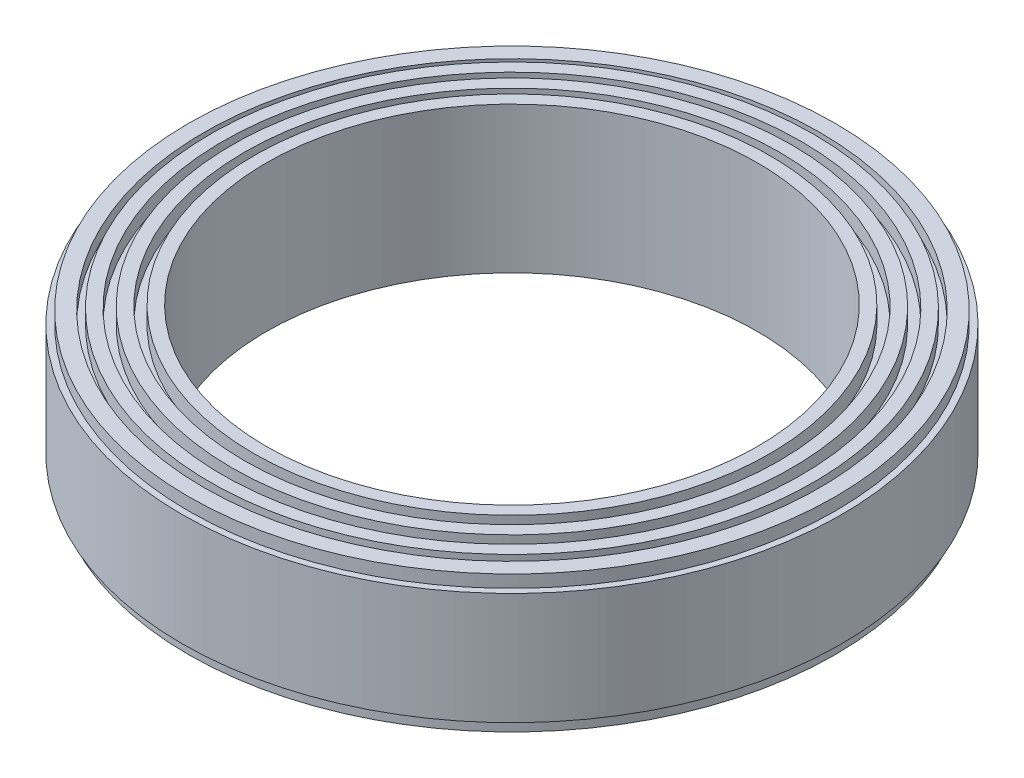
ISO-10303-21;
HEADER;
FILE_DESCRIPTION(('STEP AP214'),'2;1');
FILE_NAME('part.step','',(''),(''),'','','');
FILE_SCHEMA(('AUTOMOTIVE_DESIGN { 1 0 10303 214 1 1 1 1 }'));
ENDSEC;
DATA;
#1=APPLICATION_CONTEXT('core data for automotive mechanical design processes');
#2=APPLICATION_PROTOCOL_DEFINITION('international standard','automotive_design',2000,#1);
#3=PRODUCT_CONTEXT('',#1,'mechanical');
#4=PRODUCT('Part','Part','',(#3));
#5=PRODUCT_RELATED_PRODUCT_CATEGORY('part','',(#4));
#6=PRODUCT_DEFINITION_FORMATION('','',#4);
#7=PRODUCT_DEFINITION_CONTEXT('part definition',#1,'design');
#8=PRODUCT_DEFINITION('design','',#6,#7);
#9=PRODUCT_DEFINITION_SHAPE('','',#8);
#10=(LENGTH_UNIT() NAMED_UNIT(*) SI_UNIT(.MILLI.,.METRE.));
#11=(NAMED_UNIT(*) PLANE_ANGLE_UNIT() SI_UNIT($,.RADIAN.));
#12=(NAMED_UNIT(*) SI_UNIT($,.STERADIAN.) SOLID_ANGLE_UNIT());
#13=UNCERTAINTY_MEASURE_WITH_UNIT(LENGTH_MEASURE(1.E-05),#10,'distance_accuracy_value','');
#14=(GEOMETRIC_REPRESENTATION_CONTEXT(3) GLOBAL_UNCERTAINTY_ASSIGNED_CONTEXT((#13)) GLOBAL_UNIT_ASSIGNED_CONTEXT((#10,
#11,#12)) REPRESENTATION_CONTEXT('',''));
#15=CARTESIAN_POINT('',(0.,0.,0.));
#16=DIRECTION('',(0.,0.,1.));
#17=DIRECTION('',(1.,0.,0.));
#18=AXIS2_PLACEMENT_3D('',#15,#16,#17);
#19=CARTESIAN_POINT('',(0.,18.,0.));
#20=DIRECTION('',(0.,1.,0.));
#21=DIRECTION('',(0.,0.,1.));
#22=AXIS2_PLACEMENT_3D('',#19,#20,#21);
#23=PLANE('',#22);
#24=CARTESIAN_POINT('',(0.,18.,0.));
#25=DIRECTION('',(0.,1.,0.));
#26=DIRECTION('',(0.,0.,1.));
#27=AXIS2_PLACEMENT_3D('',#24,#25,#26);
#28=CIRCLE('',#27,104.);
#29=CARTESIAN_POINT('',(0.,18.,104.));
#30=VERTEX_POINT('',#29);
#31=EDGE_CURVE('E98',#30,#30,#28,.F.);
#32=ORIENTED_EDGE('',*,*,#31,.T.);
#33=EDGE_LOOP('',(#32));
#34=FACE_BOUND('',#33,.T.);
#35=CARTESIAN_POINT('',(0.,18.,0.));
#36=DIRECTION('',(0.,1.,0.));
#37=DIRECTION('',(0.,0.,1.));
#38=AXIS2_PLACEMENT_3D('',#35,#36,#37);
#39=CIRCLE('',#38,106.);
#40=CARTESIAN_POINT('',(0.,18.,106.));
#41=VERTEX_POINT('',#40);
#42=EDGE_CURVE('E102',#41,#41,#39,.T.);
#43=ORIENTED_EDGE('',*,*,#42,.T.);
#44=EDGE_LOOP('',(#43));
#45=FACE_BOUND('',#44,.T.);
#46=ADVANCED_FACE('F37',(#34,#45),#23,.T.);
#47=CARTESIAN_POINT('',(0.,-18.,0.));
#48=DIRECTION('',(0.,1.,0.));
#49=DIRECTION('',(0.,0.,1.));
#50=AXIS2_PLACEMENT_3D('',#47,#48,#49);
#51=PLANE('',#50);
#52=CARTESIAN_POINT('',(0.,-18.,0.));
#53=DIRECTION('',(0.,1.,0.));
#54=DIRECTION('',(0.,0.,1.));
#55=AXIS2_PLACEMENT_3D('',#52,#53,#54);
#56=CIRCLE('',#55,104.);
#57=CARTESIAN_POINT('',(0.,-18.,104.));
#58=VERTEX_POINT('',#57);
#59=EDGE_CURVE('E97',#58,#58,#56,.F.);
#60=ORIENTED_EDGE('',*,*,#59,.F.);
#61=EDGE_LOOP('',(#60));
#62=FACE_BOUND('',#61,.T.);
#63=CARTESIAN_POINT('',(0.,-18.,0.));
#64=DIRECTION('',(0.,1.,0.));
#65=DIRECTION('',(0.,0.,1.));
#66=AXIS2_PLACEMENT_3D('',#63,#64,#65);
#67=CIRCLE('',#66,106.);
#68=CARTESIAN_POINT('',(0.,-18.,106.));
#69=VERTEX_POINT('',#68);
#70=EDGE_CURVE('E101',#69,#69,#67,.T.);
#71=ORIENTED_EDGE('',*,*,#70,.F.);
#72=EDGE_LOOP('',(#71));
#73=FACE_BOUND('',#72,.T.);
#74=ADVANCED_FACE('F167',(#62,#73),#51,.F.);
#75=CARTESIAN_POINT('',(0.,18.,0.));
#76=DIRECTION('',(0.,-1.,0.));
#77=DIRECTION('',(0.,0.,-1.));
#78=AXIS2_PLACEMENT_3D('',#75,#76,#77);
#79=CYLINDRICAL_SURFACE('',#78,106.);
#80=ORIENTED_EDGE('',*,*,#42,.F.);
#81=EDGE_LOOP('',(#80));
#82=FACE_BOUND('',#81,.T.);
#83=ORIENTED_EDGE('',*,*,#70,.T.);
#84=EDGE_LOOP('',(#83));
#85=FACE_BOUND('',#84,.T.);
#86=ADVANCED_FACE('F39',(#82,#85),#79,.T.);
#87=CARTESIAN_POINT('',(0.,22.,0.));
#88=DIRECTION('',(0.,-1.,0.));
#89=DIRECTION('',(0.,0.,-1.));
#90=AXIS2_PLACEMENT_3D('',#87,#88,#89);
#91=CYLINDRICAL_SURFACE('',#90,104.);
#92=CARTESIAN_POINT('',(0.,-22.,0.));
#93=DIRECTION('',(0.,1.,0.));
#94=DIRECTION('',(0.,0.,1.));
#95=AXIS2_PLACEMENT_3D('',#92,#93,#94);
#96=CIRCLE('',#95,104.);
#97=CARTESIAN_POINT('',(0.,-22.,104.));
#98=VERTEX_POINT('',#97);
#99=EDGE_CURVE('E85',#98,#98,#96,.T.);
#100=ORIENTED_EDGE('',*,*,#99,.T.);
#101=EDGE_LOOP('',(#100));
#102=FACE_BOUND('',#101,.T.);
#103=ORIENTED_EDGE('',*,*,#59,.T.);
#104=EDGE_LOOP('',(#103));
#105=FACE_BOUND('',#104,.T.);
#106=ADVANCED_FACE('F241',(#102,#105),#91,.T.);
#107=CARTESIAN_POINT('',(0.,-22.,0.));
#108=DIRECTION('',(0.,1.,0.));
#109=DIRECTION('',(0.,0.,1.));
#110=AXIS2_PLACEMENT_3D('',#107,#108,#109);
#111=PLANE('',#110);
#112=ORIENTED_EDGE('',*,*,#99,.F.);
#113=EDGE_LOOP('',(#112));
#114=FACE_BOUND('',#113,.T.);
#115=CARTESIAN_POINT('',(0.,-22.,0.));
#116=DIRECTION('',(0.,1.,0.));
#117=DIRECTION('',(0.,0.,1.));
#118=AXIS2_PLACEMENT_3D('',#115,#116,#117);
#119=CIRCLE('',#118,99.);
#120=CARTESIAN_POINT('',(0.,-22.,99.));
#121=VERTEX_POINT('',#120);
#122=EDGE_CURVE('E81',#121,#121,#119,.T.);
#123=ORIENTED_EDGE('',*,*,#122,.T.);
#124=EDGE_LOOP('',(#123));
#125=FACE_BOUND('',#124,.T.);
#126=ADVANCED_FACE('F239',(#114,#125),#111,.F.);
#127=CARTESIAN_POINT('',(0.,22.,0.));
#128=DIRECTION('',(0.,-1.,0.));
#129=DIRECTION('',(0.,0.,-1.));
#130=AXIS2_PLACEMENT_3D('',#127,#128,#129);
#131=CYLINDRICAL_SURFACE('',#130,99.);
#132=ORIENTED_EDGE('',*,*,#122,.F.);
#133=EDGE_LOOP('',(#132));
#134=FACE_BOUND('',#133,.T.);
#135=CARTESIAN_POINT('',(0.,-18.,0.));
#136=DIRECTION('',(0.,1.,0.));
#137=DIRECTION('',(0.,0.,1.));
#138=AXIS2_PLACEMENT_3D('',#135,#136,#137);
#139=CIRCLE('',#138,99.);
#140=CARTESIAN_POINT('',(0.,-18.,99.));
#141=VERTEX_POINT('',#140);
#142=EDGE_CURVE('E91',#141,#141,#139,.F.);
#143=ORIENTED_EDGE('',*,*,#142,.F.);
#144=EDGE_LOOP('',(#143));
#145=FACE_BOUND('',#144,.T.);
#146=ADVANCED_FACE('F197',(#134,#145),#131,.F.);
#147=CARTESIAN_POINT('',(0.,22.,0.));
#148=DIRECTION('',(0.,1.,0.));
#149=DIRECTION('',(0.,0.,1.));
#150=AXIS2_PLACEMENT_3D('',#147,#148,#149);
#151=PLANE('',#150);
#152=CARTESIAN_POINT('',(0.,22.,0.));
#153=DIRECTION('',(0.,1.,0.));
#154=DIRECTION('',(0.,0.,1.));
#155=AXIS2_PLACEMENT_3D('',#152,#153,#154);
#156=CIRCLE('',#155,104.);
#157=CARTESIAN_POINT('',(0.,22.,104.));
#158=VERTEX_POINT('',#157);
#159=EDGE_CURVE('E88',#158,#158,#156,.T.);
#160=ORIENTED_EDGE('',*,*,#159,.T.);
#161=EDGE_LOOP('',(#160));
#162=FACE_BOUND('',#161,.T.);
#163=CARTESIAN_POINT('',(0.,22.,0.));
#164=DIRECTION('',(0.,1.,0.));
#165=DIRECTION('',(0.,0.,1.));
#166=AXIS2_PLACEMENT_3D('',#163,#164,#165);
#167=CIRCLE('',#166,99.);
#168=CARTESIAN_POINT('',(0.,22.,99.));
#169=VERTEX_POINT('',#168);
#170=EDGE_CURVE('E82',#169,#169,#167,.T.);
#171=ORIENTED_EDGE('',*,*,#170,.F.);
#172=EDGE_LOOP('',(#171));
#173=FACE_BOUND('',#172,.T.);
#174=ADVANCED_FACE('F235',(#162,#173),#151,.T.);
#175=ORIENTED_EDGE('',*,*,#31,.F.);
#176=EDGE_LOOP('',(#175));
#177=FACE_BOUND('',#176,.T.);
#178=ORIENTED_EDGE('',*,*,#159,.F.);
#179=EDGE_LOOP('',(#178));
#180=FACE_BOUND('',#179,.T.);
#181=ADVANCED_FACE('F194',(#177,#180),#91,.T.);
#182=CARTESIAN_POINT('',(0.,18.,0.));
#183=DIRECTION('',(0.,1.,0.));
#184=DIRECTION('',(0.,0.,1.));
#185=AXIS2_PLACEMENT_3D('',#182,#183,#184);
#186=CIRCLE('',#185,99.);
#187=CARTESIAN_POINT('',(0.,18.,99.));
#188=VERTEX_POINT('',#187);
#189=EDGE_CURVE('E94',#188,#188,#186,.F.);
#190=ORIENTED_EDGE('',*,*,#189,.T.);
#191=EDGE_LOOP('',(#190));
#192=FACE_BOUND('',#191,.T.);
#193=ORIENTED_EDGE('',*,*,#170,.T.);
#194=EDGE_LOOP('',(#193));
#195=FACE_BOUND('',#194,.T.);
#196=ADVANCED_FACE('F185',(#192,#195),#131,.F.);
#197=CARTESIAN_POINT('',(0.,18.,0.));
#198=DIRECTION('',(0.,1.,0.));
#199=DIRECTION('',(0.,0.,1.));
#200=AXIS2_PLACEMENT_3D('',#197,#198,#199);
#201=CIRCLE('',#200,97.);
#202=CARTESIAN_POINT('',(0.,18.,-97.));
#203=VERTEX_POINT('',#202);
#204=EDGE_CURVE('E78',#203,#203,#201,.F.);
#205=ORIENTED_EDGE('',*,*,#204,.T.);
#206=EDGE_LOOP('',(#205));
#207=FACE_BOUND('',#206,.T.);
#208=ORIENTED_EDGE('',*,*,#189,.F.);
#209=EDGE_LOOP('',(#208));
#210=FACE_BOUND('',#209,.T.);
#211=ADVANCED_FACE('F171',(#207,#210),#23,.T.);
#212=CARTESIAN_POINT('',(0.,-18.,0.));
#213=DIRECTION('',(0.,1.,0.));
#214=DIRECTION('',(0.,0.,1.));
#215=AXIS2_PLACEMENT_3D('',#212,#213,#214);
#216=CIRCLE('',#215,97.);
#217=CARTESIAN_POINT('',(0.,-18.,-97.));
#218=VERTEX_POINT('',#217);
#219=EDGE_CURVE('E77',#218,#218,#216,.F.);
#220=ORIENTED_EDGE('',*,*,#219,.F.);
#221=EDGE_LOOP('',(#220));
#222=FACE_BOUND('',#221,.T.);
#223=ORIENTED_EDGE('',*,*,#142,.T.);
#224=EDGE_LOOP('',(#223));
#225=FACE_BOUND('',#224,.T.);
#226=ADVANCED_FACE('F177',(#222,#225),#51,.F.);
#227=CARTESIAN_POINT('',(0.,22.5,0.));
#228=DIRECTION('',(0.,-1.,0.));
#229=DIRECTION('',(0.,0.,-1.));
#230=AXIS2_PLACEMENT_3D('',#227,#228,#229);
#231=CYLINDRICAL_SURFACE('',#230,97.);
#232=CARTESIAN_POINT('',(0.,-22.5,0.));
#233=DIRECTION('',(0.,1.,0.));
#234=DIRECTION('',(0.,0.,1.));
#235=AXIS2_PLACEMENT_3D('',#232,#233,#234);
#236=CIRCLE('',#235,97.);
#237=CARTESIAN_POINT('',(0.,-22.5,-97.));
#238=VERTEX_POINT('',#237);
#239=EDGE_CURVE('E66',#238,#238,#236,.T.);
#240=CARTESIAN_POINT('',(0.,-22.5,-97.));
#241=CARTESIAN_POINT('',(0.,-22.453125,-97.));
#242=CARTESIAN_POINT('',(0.,-22.40625,-97.));
#243=CARTESIAN_POINT('',(0.,-22.3125,-97.));
#244=CARTESIAN_POINT('',(0.,-22.265625,-97.));
#245=CARTESIAN_POINT('',(0.,-22.171875,-97.));
#246=CARTESIAN_POINT('',(0.,-22.125,-97.));
#247=CARTESIAN_POINT('',(0.,-22.03125,-97.));
#248=CARTESIAN_POINT('',(0.,-21.984375,-97.));
#249=CARTESIAN_POINT('',(0.,-21.890625,-97.));
#250=CARTESIAN_POINT('',(0.,-21.84375,-97.));
#251=CARTESIAN_POINT('',(0.,-21.75,-97.));
#252=CARTESIAN_POINT('',(0.,-21.703125,-97.));
#253=CARTESIAN_POINT('',(0.,-21.609375,-97.));
#254=CARTESIAN_POINT('',(0.,-21.5625,-97.));
#255=CARTESIAN_POINT('',(0.,-21.46875,-97.));
#256=CARTESIAN_POINT('',(0.,-21.421875,-97.));
#257=CARTESIAN_POINT('',(0.,-21.328125,-97.));
#258=CARTESIAN_POINT('',(0.,-21.28125,-97.));
#259=CARTESIAN_POINT('',(0.,-21.1875,-97.));
#260=CARTESIAN_POINT('',(0.,-21.140625,-97.));
#261=CARTESIAN_POINT('',(0.,-21.046875,-97.));
#262=CARTESIAN_POINT('',(0.,-21.,-97.));
#263=CARTESIAN_POINT('',(0.,-20.90625,-97.));
#264=CARTESIAN_POINT('',(0.,-20.859375,-97.));
#265=CARTESIAN_POINT('',(0.,-20.765625,-97.));
#266=CARTESIAN_POINT('',(0.,-20.71875,-97.));
#267=CARTESIAN_POINT('',(0.,-20.625,-97.));
#268=CARTESIAN_POINT('',(0.,-20.578125,-97.));
#269=CARTESIAN_POINT('',(0.,-20.484375,-97.));
#270=CARTESIAN_POINT('',(0.,-20.4375,-97.));
#271=CARTESIAN_POINT('',(0.,-20.34375,-97.));
#272=CARTESIAN_POINT('',(0.,-20.296875,-97.));
#273=CARTESIAN_POINT('',(0.,-20.203125,-97.));
#274=CARTESIAN_POINT('',(0.,-20.15625,-97.));
#275=CARTESIAN_POINT('',(0.,-20.0625,-97.));
#276=CARTESIAN_POINT('',(0.,-20.015625,-97.));
#277=CARTESIAN_POINT('',(0.,-19.921875,-97.));
#278=CARTESIAN_POINT('',(0.,-19.875,-97.));
#279=CARTESIAN_POINT('',(0.,-19.78125,-97.));
#280=CARTESIAN_POINT('',(0.,-19.734375,-97.));
#281=CARTESIAN_POINT('',(0.,-19.640625,-97.));
#282=CARTESIAN_POINT('',(0.,-19.59375,-97.));
#283=CARTESIAN_POINT('',(0.,-19.5,-97.));
#284=CARTESIAN_POINT('',(0.,-19.453125,-97.));
#285=CARTESIAN_POINT('',(0.,-19.359375,-97.));
#286=CARTESIAN_POINT('',(0.,-19.3125,-97.));
#287=CARTESIAN_POINT('',(0.,-19.21875,-97.));
#288=CARTESIAN_POINT('',(0.,-19.171875,-97.));
#289=CARTESIAN_POINT('',(0.,-19.078125,-97.));
#290=CARTESIAN_POINT('',(0.,-19.03125,-97.));
#291=CARTESIAN_POINT('',(0.,-18.9375,-97.));
#292=CARTESIAN_POINT('',(0.,-18.890625,-97.));
#293=CARTESIAN_POINT('',(0.,-18.796875,-97.));
#294=CARTESIAN_POINT('',(0.,-18.75,-97.));
#295=CARTESIAN_POINT('',(0.,-18.65625,-97.));
#296=CARTESIAN_POINT('',(0.,-18.609375,-97.));
#297=CARTESIAN_POINT('',(0.,-18.515625,-97.));
#298=CARTESIAN_POINT('',(0.,-18.46875,-97.));
#299=CARTESIAN_POINT('',(0.,-18.375,-97.));
#300=CARTESIAN_POINT('',(0.,-18.328125,-97.));
#301=CARTESIAN_POINT('',(0.,-18.234375,-97.));
#302=CARTESIAN_POINT('',(0.,-18.1875,-97.));
#303=CARTESIAN_POINT('',(0.,-18.09375,-97.));
#304=CARTESIAN_POINT('',(0.,-18.046875,-97.));
#305=CARTESIAN_POINT('',(0.,-18.,-97.));
#306=B_SPLINE_CURVE_WITH_KNOTS('',3,(#240,#241,#242,#243,#244,#245,#246,#247,#248,#249,#250,
#251,#252,#253,#254,#255,#256,#257,#258,#259,#260,#261,#262,#263,#264,#265,#266,#267,#268,#269,
#270,#271,#272,#273,#274,#275,#276,#277,#278,#279,#280,#281,#282,#283,#284,#285,#286,#287,#288,
#289,#290,#291,#292,#293,#294,#295,#296,#297,#298,#299,#300,#301,#302,#303,#304,#305),
.UNSPECIFIED.,.F.,.F.,(4,2,2,2,2,2,2,2,2,2,2,2,2,2,2,2,2,2,2,2,2,2,2,2,2,2,2,2,2,2,2,2,4),(0.,
0.140624999999998,0.281249999999997,0.421875000000002,0.5625,0.703124999999999,
0.843750000000004,0.984375000000003,1.125,1.265625,1.40625,1.546875,1.6875,1.828125,
1.96875000000001,2.109375,2.25,2.390625,2.53125,2.671875,2.8125,2.953125,3.09375000000001,
3.234375,3.375,3.515625,3.65625,3.79687500000001,3.9375,4.078125,4.21875000000001,
4.35937500000001,4.5),.UNSPECIFIED.);
#307=EDGE_CURVE('BSEAM191',#238,#218,#306,.T.);
#308=ORIENTED_EDGE('',*,*,#239,.T.);
#309=ORIENTED_EDGE('',*,*,#219,.T.);
#310=ORIENTED_EDGE('',*,*,#307,.T.);
#311=ORIENTED_EDGE('',*,*,#307,.F.);
#312=EDGE_LOOP('',(#308,#310,#309,#311));
#313=FACE_BOUND('',#312,.T.);
#314=ADVANCED_FACE('F191',(#313),#231,.T.);
#315=CARTESIAN_POINT('',(0.,-22.5,0.));
#316=DIRECTION('',(0.,1.,0.));
#317=DIRECTION('',(0.,0.,1.));
#318=AXIS2_PLACEMENT_3D('',#315,#316,#317);
#319=PLANE('',#318);
#320=ORIENTED_EDGE('',*,*,#239,.F.);
#321=EDGE_LOOP('',(#320));
#322=FACE_BOUND('',#321,.T.);
#323=CARTESIAN_POINT('',(0.,-22.5,0.));
#324=DIRECTION('',(0.,1.,0.));
#325=DIRECTION('',(0.,0.,1.));
#326=AXIS2_PLACEMENT_3D('',#323,#324,#325);
#327=CIRCLE('',#326,93.);
#328=CARTESIAN_POINT('',(0.,-22.5,-93.));
#329=VERTEX_POINT('',#328);
#330=EDGE_CURVE('E61',#329,#329,#327,.T.);
#331=ORIENTED_EDGE('',*,*,#330,.T.);
#332=EDGE_LOOP('',(#331));
#333=FACE_BOUND('',#332,.T.);
#334=ADVANCED_FACE('F228',(#322,#333),#319,.F.);
#335=CARTESIAN_POINT('',(0.,22.5,0.));
#336=DIRECTION('',(0.,-1.,0.));
#337=DIRECTION('',(0.,0.,-1.));
#338=AXIS2_PLACEMENT_3D('',#335,#336,#337);
#339=CYLINDRICAL_SURFACE('',#338,93.);
#340=CARTESIAN_POINT('',(0.,-18.,0.));
#341=DIRECTION('',(0.,1.,0.));
#342=DIRECTION('',(0.,0.,1.));
#343=AXIS2_PLACEMENT_3D('',#340,#341,#342);
#344=CIRCLE('',#343,93.);
#345=CARTESIAN_POINT('',(0.,-18.,-93.));
#346=VERTEX_POINT('',#345);
#347=EDGE_CURVE('E72',#346,#346,#344,.F.);
#348=CARTESIAN_POINT('',(0.,-22.5,-93.));
#349=CARTESIAN_POINT('',(0.,-22.453125,-93.));
#350=CARTESIAN_POINT('',(0.,-22.40625,-93.));
#351=CARTESIAN_POINT('',(0.,-22.3125,-93.));
#352=CARTESIAN_POINT('',(0.,-22.265625,-93.));
#353=CARTESIAN_POINT('',(0.,-22.171875,-93.));
#354=CARTESIAN_POINT('',(0.,-22.125,-93.));
#355=CARTESIAN_POINT('',(0.,-22.03125,-93.));
#356=CARTESIAN_POINT('',(0.,-21.984375,-93.));
#357=CARTESIAN_POINT('',(0.,-21.890625,-93.));
#358=CARTESIAN_POINT('',(0.,-21.84375,-93.));
#359=CARTESIAN_POINT('',(0.,-21.75,-93.));
#360=CARTESIAN_POINT('',(0.,-21.703125,-93.));
#361=CARTESIAN_POINT('',(0.,-21.609375,-93.));
#362=CARTESIAN_POINT('',(0.,-21.5625,-93.));
#363=CARTESIAN_POINT('',(0.,-21.46875,-93.));
#364=CARTESIAN_POINT('',(0.,-21.421875,-93.));
#365=CARTESIAN_POINT('',(0.,-21.328125,-93.));
#366=CARTESIAN_POINT('',(0.,-21.28125,-93.));
#367=CARTESIAN_POINT('',(0.,-21.1875,-93.));
#368=CARTESIAN_POINT('',(0.,-21.140625,-93.));
#369=CARTESIAN_POINT('',(0.,-21.046875,-93.));
#370=CARTESIAN_POINT('',(0.,-21.,-93.));
#371=CARTESIAN_POINT('',(0.,-20.90625,-93.));
#372=CARTESIAN_POINT('',(0.,-20.859375,-93.));
#373=CARTESIAN_POINT('',(0.,-20.765625,-93.));
#374=CARTESIAN_POINT('',(0.,-20.71875,-93.));
#375=CARTESIAN_POINT('',(0.,-20.625,-93.));
#376=CARTESIAN_POINT('',(0.,-20.578125,-93.));
#377=CARTESIAN_POINT('',(0.,-20.484375,-93.));
#378=CARTESIAN_POINT('',(0.,-20.4375,-93.));
#379=CARTESIAN_POINT('',(0.,-20.34375,-93.));
#380=CARTESIAN_POINT('',(0.,-20.296875,-93.));
#381=CARTESIAN_POINT('',(0.,-20.203125,-93.));
#382=CARTESIAN_POINT('',(0.,-20.15625,-93.));
#383=CARTESIAN_POINT('',(0.,-20.0625,-93.));
#384=CARTESIAN_POINT('',(0.,-20.015625,-93.));
#385=CARTESIAN_POINT('',(0.,-19.921875,-93.));
#386=CARTESIAN_POINT('',(0.,-19.875,-93.));
#387=CARTESIAN_POINT('',(0.,-19.78125,-93.));
#388=CARTESIAN_POINT('',(0.,-19.734375,-93.));
#389=CARTESIAN_POINT('',(0.,-19.640625,-93.));
#390=CARTESIAN_POINT('',(0.,-19.59375,-93.));
#391=CARTESIAN_POINT('',(0.,-19.5,-93.));
#392=CARTESIAN_POINT('',(0.,-19.453125,-93.));
#393=CARTESIAN_POINT('',(0.,-19.359375,-93.));
#394=CARTESIAN_POINT('',(0.,-19.3125,-93.));
#395=CARTESIAN_POINT('',(0.,-19.21875,-93.));
#396=CARTESIAN_POINT('',(0.,-19.171875,-93.));
#397=CARTESIAN_POINT('',(0.,-19.078125,-93.));
#398=CARTESIAN_POINT('',(0.,-19.03125,-93.));
#399=CARTESIAN_POINT('',(0.,-18.9375,-93.));
#400=CARTESIAN_POINT('',(0.,-18.890625,-93.));
#401=CARTESIAN_POINT('',(0.,-18.796875,-93.));
#402=CARTESIAN_POINT('',(0.,-18.75,-93.));
#403=CARTESIAN_POINT('',(0.,-18.65625,-93.));
#404=CARTESIAN_POINT('',(0.,-18.609375,-93.));
#405=CARTESIAN_POINT('',(0.,-18.515625,-93.));
#406=CARTESIAN_POINT('',(0.,-18.46875,-93.));
#407=CARTESIAN_POINT('',(0.,-18.375,-93.));
#408=CARTESIAN_POINT('',(0.,-18.328125,-93.));
#409=CARTESIAN_POINT('',(0.,-18.234375,-93.));
#410=CARTESIAN_POINT('',(0.,-18.1875,-93.));
#411=CARTESIAN_POINT('',(0.,-18.09375,-93.));
#412=CARTESIAN_POINT('',(0.,-18.046875,-93.));
#413=CARTESIAN_POINT('',(0.,-18.,-93.));
#414=B_SPLINE_CURVE_WITH_KNOTS('',3,(#348,#349,#350,#351,#352,#353,#354,#355,#356,#357,#358,
#359,#360,#361,#362,#363,#364,#365,#366,#367,#368,#369,#370,#371,#372,#373,#374,#375,#376,#377,
#378,#379,#380,#381,#382,#383,#384,#385,#386,#387,#388,#389,#390,#391,#392,#393,#394,#395,#396,
#397,#398,#399,#400,#401,#402,#403,#404,#405,#406,#407,#408,#409,#410,#411,#412,#413),
.UNSPECIFIED.,.F.,.F.,(4,2,2,2,2,2,2,2,2,2,2,2,2,2,2,2,2,2,2,2,2,2,2,2,2,2,2,2,2,2,2,2,4),(0.,
0.140624999999998,0.281249999999997,0.421875000000002,0.5625,0.703124999999999,
0.843750000000004,0.984375000000003,1.125,1.265625,1.40625,1.546875,1.6875,1.828125,
1.96875000000001,2.109375,2.25,2.390625,2.53125,2.671875,2.8125,2.953125,3.09375000000001,
3.234375,3.375,3.515625,3.65625,3.79687500000001,3.9375,4.078125,4.21875000000001,
4.35937500000001,4.5),.UNSPECIFIED.);
#415=EDGE_CURVE('BSEAM211',#329,#346,#414,.T.);
#416=ORIENTED_EDGE('',*,*,#330,.F.);
#417=ORIENTED_EDGE('',*,*,#347,.F.);
#418=ORIENTED_EDGE('',*,*,#415,.T.);
#419=ORIENTED_EDGE('',*,*,#415,.F.);
#420=EDGE_LOOP('',(#416,#418,#417,#419));
#421=FACE_BOUND('',#420,.T.);
#422=ADVANCED_FACE('F211',(#421),#339,.F.);
#423=CARTESIAN_POINT('',(0.,22.5,0.));
#424=DIRECTION('',(0.,1.,0.));
#425=DIRECTION('',(0.,0.,1.));
#426=AXIS2_PLACEMENT_3D('',#423,#424,#425);
#427=PLANE('',#426);
#428=CARTESIAN_POINT('',(0.,22.5,0.));
#429=DIRECTION('',(0.,1.,0.));
#430=DIRECTION('',(0.,0.,1.));
#431=AXIS2_PLACEMENT_3D('',#428,#429,#430);
#432=CIRCLE('',#431,97.);
#433=CARTESIAN_POINT('',(0.,22.5,-97.));
#434=VERTEX_POINT('',#433);
#435=EDGE_CURVE('E69',#434,#434,#432,.T.);
#436=ORIENTED_EDGE('',*,*,#435,.T.);
#437=EDGE_LOOP('',(#436));
#438=FACE_BOUND('',#437,.T.);
#439=CARTESIAN_POINT('',(0.,22.5,0.));
#440=DIRECTION('',(0.,1.,0.));
#441=DIRECTION('',(0.,0.,1.));
#442=AXIS2_PLACEMENT_3D('',#439,#440,#441);
#443=CIRCLE('',#442,93.);
#444=CARTESIAN_POINT('',(0.,22.5,-93.));
#445=VERTEX_POINT('',#444);
#446=EDGE_CURVE('E63',#445,#445,#443,.T.);
#447=ORIENTED_EDGE('',*,*,#446,.F.);
#448=EDGE_LOOP('',(#447));
#449=FACE_BOUND('',#448,.T.);
#450=ADVANCED_FACE('F218',(#438,#449),#427,.T.);
#451=CARTESIAN_POINT('',(0.,18.,-97.));
#452=CARTESIAN_POINT('',(0.,18.046875,-97.));
#453=CARTESIAN_POINT('',(0.,18.09375,-97.));
#454=CARTESIAN_POINT('',(0.,18.1875,-97.));
#455=CARTESIAN_POINT('',(0.,18.234375,-97.));
#456=CARTESIAN_POINT('',(0.,18.328125,-97.));
#457=CARTESIAN_POINT('',(0.,18.375,-97.));
#458=CARTESIAN_POINT('',(0.,18.46875,-97.));
#459=CARTESIAN_POINT('',(0.,18.515625,-97.));
#460=CARTESIAN_POINT('',(0.,18.609375,-97.));
#461=CARTESIAN_POINT('',(0.,18.65625,-97.));
#462=CARTESIAN_POINT('',(0.,18.75,-97.));
#463=CARTESIAN_POINT('',(0.,18.796875,-97.));
#464=CARTESIAN_POINT('',(0.,18.890625,-97.));
#465=CARTESIAN_POINT('',(0.,18.9375,-97.));
#466=CARTESIAN_POINT('',(0.,19.03125,-97.));
#467=CARTESIAN_POINT('',(0.,19.078125,-97.));
#468=CARTESIAN_POINT('',(0.,19.171875,-97.));
#469=CARTESIAN_POINT('',(0.,19.21875,-97.));
#470=CARTESIAN_POINT('',(0.,19.3125,-97.));
#471=CARTESIAN_POINT('',(0.,19.359375,-97.));
#472=CARTESIAN_POINT('',(0.,19.453125,-97.));
#473=CARTESIAN_POINT('',(0.,19.5,-97.));
#474=CARTESIAN_POINT('',(0.,19.59375,-97.));
#475=CARTESIAN_POINT('',(0.,19.640625,-97.));
#476=CARTESIAN_POINT('',(0.,19.734375,-97.));
#477=CARTESIAN_POINT('',(0.,19.78125,-97.));
#478=CARTESIAN_POINT('',(0.,19.875,-97.));
#479=CARTESIAN_POINT('',(0.,19.921875,-97.));
#480=CARTESIAN_POINT('',(0.,20.015625,-97.));
#481=CARTESIAN_POINT('',(0.,20.0625,-97.));
#482=CARTESIAN_POINT('',(0.,20.15625,-97.));
#483=CARTESIAN_POINT('',(0.,20.203125,-97.));
#484=CARTESIAN_POINT('',(0.,20.296875,-97.));
#485=CARTESIAN_POINT('',(0.,20.34375,-97.));
#486=CARTESIAN_POINT('',(0.,20.4375,-97.));
#487=CARTESIAN_POINT('',(0.,20.484375,-97.));
#488=CARTESIAN_POINT('',(0.,20.578125,-97.));
#489=CARTESIAN_POINT('',(0.,20.625,-97.));
#490=CARTESIAN_POINT('',(0.,20.71875,-97.));
#491=CARTESIAN_POINT('',(0.,20.765625,-97.));
#492=CARTESIAN_POINT('',(0.,20.859375,-97.));
#493=CARTESIAN_POINT('',(0.,20.90625,-97.));
#494=CARTESIAN_POINT('',(0.,21.,-97.));
#495=CARTESIAN_POINT('',(0.,21.046875,-97.));
#496=CARTESIAN_POINT('',(0.,21.140625,-97.));
#497=CARTESIAN_POINT('',(0.,21.1875,-97.));
#498=CARTESIAN_POINT('',(0.,21.28125,-97.));
#499=CARTESIAN_POINT('',(0.,21.328125,-97.));
#500=CARTESIAN_POINT('',(0.,21.421875,-97.));
#501=CARTESIAN_POINT('',(0.,21.46875,-97.));
#502=CARTESIAN_POINT('',(0.,21.5625,-97.));
#503=CARTESIAN_POINT('',(0.,21.609375,-97.));
#504=CARTESIAN_POINT('',(0.,21.703125,-97.));
#505=CARTESIAN_POINT('',(0.,21.75,-97.));
#506=CARTESIAN_POINT('',(0.,21.84375,-97.));
#507=CARTESIAN_POINT('',(0.,21.890625,-97.));
#508=CARTESIAN_POINT('',(0.,21.984375,-97.));
#509=CARTESIAN_POINT('',(0.,22.03125,-97.));
#510=CARTESIAN_POINT('',(0.,22.125,-97.));
#511=CARTESIAN_POINT('',(0.,22.171875,-97.));
#512=CARTESIAN_POINT('',(0.,22.265625,-97.));
#513=CARTESIAN_POINT('',(0.,22.3125,-97.));
#514=CARTESIAN_POINT('',(0.,22.40625,-97.));
#515=CARTESIAN_POINT('',(0.,22.453125,-97.));
#516=CARTESIAN_POINT('',(0.,22.5,-97.));
#517=B_SPLINE_CURVE_WITH_KNOTS('',3,(#451,#452,#453,#454,#455,#456,#457,#458,#459,#460,#461,
#462,#463,#464,#465,#466,#467,#468,#469,#470,#471,#472,#473,#474,#475,#476,#477,#478,#479,#480,
#481,#482,#483,#484,#485,#486,#487,#488,#489,#490,#491,#492,#493,#494,#495,#496,#497,#498,#499,
#500,#501,#502,#503,#504,#505,#506,#507,#508,#509,#510,#511,#512,#513,#514,#515,#516),
.UNSPECIFIED.,.F.,.F.,(4,2,2,2,2,2,2,2,2,2,2,2,2,2,2,2,2,2,2,2,2,2,2,2,2,2,2,2,2,2,2,2,4),(0.,
0.140624999999998,0.28125,0.421874999999999,0.5625,0.703124999999999,0.843749999999997,
0.984374999999999,1.125,1.265625,1.40625,1.546875,1.6875,1.828125,1.96875,2.109375,2.25,
2.390625,2.53125,2.671875,2.8125,2.953125,3.09375,3.234375,3.375,3.515625,3.65625,3.796875,
3.9375,4.078125,4.21875,4.359375,4.5),.UNSPECIFIED.);
#518=EDGE_CURVE('BSEAM208',#203,#434,#517,.T.);
#519=ORIENTED_EDGE('',*,*,#204,.F.);
#520=ORIENTED_EDGE('',*,*,#435,.F.);
#521=ORIENTED_EDGE('',*,*,#518,.T.);
#522=ORIENTED_EDGE('',*,*,#518,.F.);
#523=EDGE_LOOP('',(#519,#521,#520,#522));
#524=FACE_BOUND('',#523,.T.);
#525=ADVANCED_FACE('F208',(#524),#231,.T.);
#526=CARTESIAN_POINT('',(0.,18.,0.));
#527=DIRECTION('',(0.,1.,0.));
#528=DIRECTION('',(0.,0.,1.));
#529=AXIS2_PLACEMENT_3D('',#526,#527,#528);
#530=CIRCLE('',#529,93.);
#531=CARTESIAN_POINT('',(0.,18.,-93.));
#532=VERTEX_POINT('',#531);
#533=EDGE_CURVE('E53',#532,#532,#530,.F.);
#534=CARTESIAN_POINT('',(0.,18.,-93.));
#535=CARTESIAN_POINT('',(0.,18.046875,-93.));
#536=CARTESIAN_POINT('',(0.,18.09375,-93.));
#537=CARTESIAN_POINT('',(0.,18.1875,-93.));
#538=CARTESIAN_POINT('',(0.,18.234375,-93.));
#539=CARTESIAN_POINT('',(0.,18.328125,-93.));
#540=CARTESIAN_POINT('',(0.,18.375,-93.));
#541=CARTESIAN_POINT('',(0.,18.46875,-93.));
#542=CARTESIAN_POINT('',(0.,18.515625,-93.));
#543=CARTESIAN_POINT('',(0.,18.609375,-93.));
#544=CARTESIAN_POINT('',(0.,18.65625,-93.));
#545=CARTESIAN_POINT('',(0.,18.75,-93.));
#546=CARTESIAN_POINT('',(0.,18.796875,-93.));
#547=CARTESIAN_POINT('',(0.,18.890625,-93.));
#548=CARTESIAN_POINT('',(0.,18.9375,-93.));
#549=CARTESIAN_POINT('',(0.,19.03125,-93.));
#550=CARTESIAN_POINT('',(0.,19.078125,-93.));
#551=CARTESIAN_POINT('',(0.,19.171875,-93.));
#552=CARTESIAN_POINT('',(0.,19.21875,-93.));
#553=CARTESIAN_POINT('',(0.,19.3125,-93.));
#554=CARTESIAN_POINT('',(0.,19.359375,-93.));
#555=CARTESIAN_POINT('',(0.,19.453125,-93.));
#556=CARTESIAN_POINT('',(0.,19.5,-93.));
#557=CARTESIAN_POINT('',(0.,19.59375,-93.));
#558=CARTESIAN_POINT('',(0.,19.640625,-93.));
#559=CARTESIAN_POINT('',(0.,19.734375,-93.));
#560=CARTESIAN_POINT('',(0.,19.78125,-93.));
#561=CARTESIAN_POINT('',(0.,19.875,-93.));
#562=CARTESIAN_POINT('',(0.,19.921875,-93.));
#563=CARTESIAN_POINT('',(0.,20.015625,-93.));
#564=CARTESIAN_POINT('',(0.,20.0625,-93.));
#565=CARTESIAN_POINT('',(0.,20.15625,-93.));
#566=CARTESIAN_POINT('',(0.,20.203125,-93.));
#567=CARTESIAN_POINT('',(0.,20.296875,-93.));
#568=CARTESIAN_POINT('',(0.,20.34375,-93.));
#569=CARTESIAN_POINT('',(0.,20.4375,-93.));
#570=CARTESIAN_POINT('',(0.,20.484375,-93.));
#571=CARTESIAN_POINT('',(0.,20.578125,-93.));
#572=CARTESIAN_POINT('',(0.,20.625,-93.));
#573=CARTESIAN_POINT('',(0.,20.71875,-93.));
#574=CARTESIAN_POINT('',(0.,20.765625,-93.));
#575=CARTESIAN_POINT('',(0.,20.859375,-93.));
#576=CARTESIAN_POINT('',(0.,20.90625,-93.));
#577=CARTESIAN_POINT('',(0.,21.,-93.));
#578=CARTESIAN_POINT('',(0.,21.046875,-93.));
#579=CARTESIAN_POINT('',(0.,21.140625,-93.));
#580=CARTESIAN_POINT('',(0.,21.1875,-93.));
#581=CARTESIAN_POINT('',(0.,21.28125,-93.));
#582=CARTESIAN_POINT('',(0.,21.328125,-93.));
#583=CARTESIAN_POINT('',(0.,21.421875,-93.));
#584=CARTESIAN_POINT('',(0.,21.46875,-93.));
#585=CARTESIAN_POINT('',(0.,21.5625,-93.));
#586=CARTESIAN_POINT('',(0.,21.609375,-93.));
#587=CARTESIAN_POINT('',(0.,21.703125,-93.));
#588=CARTESIAN_POINT('',(0.,21.75,-93.));
#589=CARTESIAN_POINT('',(0.,21.84375,-93.));
#590=CARTESIAN_POINT('',(0.,21.890625,-93.));
#591=CARTESIAN_POINT('',(0.,21.984375,-93.));
#592=CARTESIAN_POINT('',(0.,22.03125,-93.));
#593=CARTESIAN_POINT('',(0.,22.125,-93.));
#594=CARTESIAN_POINT('',(0.,22.171875,-93.));
#595=CARTESIAN_POINT('',(0.,22.265625,-93.));
#596=CARTESIAN_POINT('',(0.,22.3125,-93.));
#597=CARTESIAN_POINT('',(0.,22.40625,-93.));
#598=CARTESIAN_POINT('',(0.,22.453125,-93.));
#599=CARTESIAN_POINT('',(0.,22.5,-93.));
#600=B_SPLINE_CURVE_WITH_KNOTS('',3,(#534,#535,#536,#537,#538,#539,#540,#541,#542,#543,#544,
#545,#546,#547,#548,#549,#550,#551,#552,#553,#554,#555,#556,#557,#558,#559,#560,#561,#562,#563,
#564,#565,#566,#567,#568,#569,#570,#571,#572,#573,#574,#575,#576,#577,#578,#579,#580,#581,#582,
#583,#584,#585,#586,#587,#588,#589,#590,#591,#592,#593,#594,#595,#596,#597,#598,#599),
.UNSPECIFIED.,.F.,.F.,(4,2,2,2,2,2,2,2,2,2,2,2,2,2,2,2,2,2,2,2,2,2,2,2,2,2,2,2,2,2,2,2,4),(0.,
0.140624999999998,0.28125,0.421874999999999,0.5625,0.703124999999999,0.843749999999997,
0.984374999999999,1.125,1.265625,1.40625,1.546875,1.6875,1.828125,1.96875,2.109375,2.25,
2.390625,2.53125,2.671875,2.8125,2.953125,3.09375,3.234375,3.375,3.515625,3.65625,3.796875,
3.9375,4.078125,4.21875,4.359375,4.5),.UNSPECIFIED.);
#601=EDGE_CURVE('BSEAM200',#532,#445,#600,.T.);
#602=ORIENTED_EDGE('',*,*,#533,.T.);
#603=ORIENTED_EDGE('',*,*,#446,.T.);
#604=ORIENTED_EDGE('',*,*,#601,.T.);
#605=ORIENTED_EDGE('',*,*,#601,.F.);
#606=EDGE_LOOP('',(#602,#604,#603,#605));
#607=FACE_BOUND('',#606,.T.);
#608=ADVANCED_FACE('F200',(#607),#339,.F.);
#609=CARTESIAN_POINT('',(0.,18.,0.));
#610=DIRECTION('',(0.,1.,0.));
#611=DIRECTION('',(0.,0.,1.));
#612=AXIS2_PLACEMENT_3D('',#609,#610,#611);
#613=CIRCLE('',#612,90.);
#614=CARTESIAN_POINT('',(0.,18.,90.));
#615=VERTEX_POINT('',#614);
#616=EDGE_CURVE('E58',#615,#615,#613,.F.);
#617=ORIENTED_EDGE('',*,*,#616,.T.);
#618=EDGE_LOOP('',(#617));
#619=FACE_BOUND('',#618,.T.);
#620=ORIENTED_EDGE('',*,*,#533,.F.);
#621=EDGE_LOOP('',(#620));
#622=FACE_BOUND('',#621,.T.);
#623=ADVANCED_FACE('F183',(#619,#622),#23,.T.);
#624=CARTESIAN_POINT('',(0.,-18.,0.));
#625=DIRECTION('',(0.,1.,0.));
#626=DIRECTION('',(0.,0.,1.));
#627=AXIS2_PLACEMENT_3D('',#624,#625,#626);
#628=CIRCLE('',#627,90.);
#629=CARTESIAN_POINT('',(0.,-18.,90.));
#630=VERTEX_POINT('',#629);
#631=EDGE_CURVE('E48',#630,#630,#628,.F.);
#632=ORIENTED_EDGE('',*,*,#631,.F.);
#633=EDGE_LOOP('',(#632));
#634=FACE_BOUND('',#633,.T.);
#635=ORIENTED_EDGE('',*,*,#347,.T.);
#636=EDGE_LOOP('',(#635));
#637=FACE_BOUND('',#636,.T.);
#638=ADVANCED_FACE('F193',(#634,#637),#51,.F.);
#639=CARTESIAN_POINT('',(0.,23.,0.));
#640=DIRECTION('',(0.,-1.,0.));
#641=DIRECTION('',(0.,0.,-1.));
#642=AXIS2_PLACEMENT_3D('',#639,#640,#641);
#643=CYLINDRICAL_SURFACE('',#642,90.);
#644=CARTESIAN_POINT('',(0.,-23.,0.));
#645=DIRECTION('',(0.,1.,0.));
#646=DIRECTION('',(0.,0.,1.));
#647=AXIS2_PLACEMENT_3D('',#644,#645,#646);
#648=CIRCLE('',#647,90.);
#649=CARTESIAN_POINT('',(0.,-23.,90.));
#650=VERTEX_POINT('',#649);
#651=EDGE_CURVE('E56',#650,#650,#648,.T.);
#652=ORIENTED_EDGE('',*,*,#651,.T.);
#653=EDGE_LOOP('',(#652));
#654=FACE_BOUND('',#653,.T.);
#655=ORIENTED_EDGE('',*,*,#631,.T.);
#656=EDGE_LOOP('',(#655));
#657=FACE_BOUND('',#656,.T.);
#658=ADVANCED_FACE('F206',(#654,#657),#643,.T.);
#659=CARTESIAN_POINT('',(0.,-23.,0.));
#660=DIRECTION('',(0.,1.,0.));
#661=DIRECTION('',(0.,0.,1.));
#662=AXIS2_PLACEMENT_3D('',#659,#660,#661);
#663=PLANE('',#662);
#664=ORIENTED_EDGE('',*,*,#651,.F.);
#665=EDGE_LOOP('',(#664));
#666=FACE_BOUND('',#665,.T.);
#667=CARTESIAN_POINT('',(0.,-23.,0.));
#668=DIRECTION('',(0.,1.,0.));
#669=DIRECTION('',(0.,0.,1.));
#670=AXIS2_PLACEMENT_3D('',#667,#668,#669);
#671=CIRCLE('',#670,86.);
#672=CARTESIAN_POINT('',(0.,-23.,86.));
#673=VERTEX_POINT('',#672);
#674=EDGE_CURVE('E125',#673,#673,#671,.T.);
#675=ORIENTED_EDGE('',*,*,#674,.T.);
#676=EDGE_LOOP('',(#675));
#677=FACE_BOUND('',#676,.T.);
#678=ADVANCED_FACE('F354',(#666,#677),#663,.F.);
#679=CARTESIAN_POINT('',(0.,23.,0.));
#680=DIRECTION('',(0.,-1.,0.));
#681=DIRECTION('',(0.,0.,-1.));
#682=AXIS2_PLACEMENT_3D('',#679,#680,#681);
#683=CYLINDRICAL_SURFACE('',#682,86.);
#684=ORIENTED_EDGE('',*,*,#674,.F.);
#685=EDGE_LOOP('',(#684));
#686=FACE_BOUND('',#685,.T.);
#687=CARTESIAN_POINT('',(0.,-18.,0.));
#688=DIRECTION('',(0.,1.,0.));
#689=DIRECTION('',(0.,0.,1.));
#690=AXIS2_PLACEMENT_3D('',#687,#688,#689);
#691=CIRCLE('',#690,86.);
#692=CARTESIAN_POINT('',(0.,-18.,86.));
#693=VERTEX_POINT('',#692);
#694=EDGE_CURVE('E62',#693,#693,#691,.F.);
#695=ORIENTED_EDGE('',*,*,#694,.F.);
#696=EDGE_LOOP('',(#695));
#697=FACE_BOUND('',#696,.T.);
#698=ADVANCED_FACE('F364',(#686,#697),#683,.F.);
#699=CARTESIAN_POINT('',(0.,23.,0.));
#700=DIRECTION('',(0.,1.,0.));
#701=DIRECTION('',(0.,0.,1.));
#702=AXIS2_PLACEMENT_3D('',#699,#700,#701);
#703=PLANE('',#702);
#704=CARTESIAN_POINT('',(0.,23.,0.));
#705=DIRECTION('',(0.,1.,0.));
#706=DIRECTION('',(0.,0.,1.));
#707=AXIS2_PLACEMENT_3D('',#704,#705,#706);
#708=CIRCLE('',#707,90.);
#709=CARTESIAN_POINT('',(0.,23.,90.));
#710=VERTEX_POINT('',#709);
#711=EDGE_CURVE('E116',#710,#710,#708,.T.);
#712=ORIENTED_EDGE('',*,*,#711,.T.);
#713=EDGE_LOOP('',(#712));
#714=FACE_BOUND('',#713,.T.);
#715=CARTESIAN_POINT('',(0.,23.,0.));
#716=DIRECTION('',(0.,1.,0.));
#717=DIRECTION('',(0.,0.,1.));
#718=AXIS2_PLACEMENT_3D('',#715,#716,#717);
#719=CIRCLE('',#718,86.);
#720=CARTESIAN_POINT('',(0.,23.,86.));
#721=VERTEX_POINT('',#720);
#722=EDGE_CURVE('E123',#721,#721,#719,.T.);
#723=ORIENTED_EDGE('',*,*,#722,.F.);
#724=EDGE_LOOP('',(#723));
#725=FACE_BOUND('',#724,.T.);
#726=ADVANCED_FACE('F374',(#714,#725),#703,.T.);
#727=ORIENTED_EDGE('',*,*,#616,.F.);
#728=EDGE_LOOP('',(#727));
#729=FACE_BOUND('',#728,.T.);
#730=ORIENTED_EDGE('',*,*,#711,.F.);
#731=EDGE_LOOP('',(#730));
#732=FACE_BOUND('',#731,.T.);
#733=ADVANCED_FACE('F356',(#729,#732),#643,.T.);
#734=CARTESIAN_POINT('',(0.,18.,0.));
#735=DIRECTION('',(0.,1.,0.));
#736=DIRECTION('',(0.,0.,1.));
#737=AXIS2_PLACEMENT_3D('',#734,#735,#736);
#738=CIRCLE('',#737,86.);
#739=CARTESIAN_POINT('',(0.,18.,86.));
#740=VERTEX_POINT('',#739);
#741=EDGE_CURVE('E44',#740,#740,#738,.F.);
#742=ORIENTED_EDGE('',*,*,#741,.T.);
#743=EDGE_LOOP('',(#742));
#744=FACE_BOUND('',#743,.T.);
#745=ORIENTED_EDGE('',*,*,#722,.T.);
#746=EDGE_LOOP('',(#745));
#747=FACE_BOUND('',#746,.T.);
#748=ADVANCED_FACE('F181',(#744,#747),#683,.F.);
#749=CARTESIAN_POINT('',(0.,18.,0.));
#750=DIRECTION('',(0.,1.,0.));
#751=DIRECTION('',(0.,0.,1.));
#752=AXIS2_PLACEMENT_3D('',#749,#750,#751);
#753=CIRCLE('',#752,83.);
#754=CARTESIAN_POINT('',(0.,18.,83.));
#755=VERTEX_POINT('',#754);
#756=EDGE_CURVE('E128',#755,#755,#753,.F.);
#757=ORIENTED_EDGE('',*,*,#756,.T.);
#758=EDGE_LOOP('',(#757));
#759=FACE_BOUND('',#758,.T.);
#760=ORIENTED_EDGE('',*,*,#741,.F.);
#761=EDGE_LOOP('',(#760));
#762=FACE_BOUND('',#761,.T.);
#763=ADVANCED_FACE('F170',(#759,#762),#23,.T.);
#764=CARTESIAN_POINT('',(0.,-18.,0.));
#765=DIRECTION('',(0.,1.,0.));
#766=DIRECTION('',(0.,0.,1.));
#767=AXIS2_PLACEMENT_3D('',#764,#765,#766);
#768=CIRCLE('',#767,83.);
#769=CARTESIAN_POINT('',(0.,-18.,83.));
#770=VERTEX_POINT('',#769);
#771=EDGE_CURVE('E10',#770,#770,#768,.F.);
#772=ORIENTED_EDGE('',*,*,#771,.F.);
#773=EDGE_LOOP('',(#772));
#774=FACE_BOUND('',#773,.T.);
#775=ORIENTED_EDGE('',*,*,#694,.T.);
#776=EDGE_LOOP('',(#775));
#777=FACE_BOUND('',#776,.T.);
#778=ADVANCED_FACE('F162',(#774,#777),#51,.F.);
#779=CARTESIAN_POINT('',(0.,23.5,0.));
#780=DIRECTION('',(0.,-1.,0.));
#781=DIRECTION('',(0.,0.,-1.));
#782=AXIS2_PLACEMENT_3D('',#779,#780,#781);
#783=CYLINDRICAL_SURFACE('',#782,83.);
#784=CARTESIAN_POINT('',(0.,-23.5,0.));
#785=DIRECTION('',(0.,1.,0.));
#786=DIRECTION('',(0.,0.,1.));
#787=AXIS2_PLACEMENT_3D('',#784,#785,#786);
#788=CIRCLE('',#787,83.);
#789=CARTESIAN_POINT('',(0.,-23.5,83.));
#790=VERTEX_POINT('',#789);
#791=EDGE_CURVE('E134',#790,#790,#788,.T.);
#792=ORIENTED_EDGE('',*,*,#791,.T.);
#793=EDGE_LOOP('',(#792));
#794=FACE_BOUND('',#793,.T.);
#795=ORIENTED_EDGE('',*,*,#771,.T.);
#796=EDGE_LOOP('',(#795));
#797=FACE_BOUND('',#796,.T.);
#798=ADVANCED_FACE('F152',(#794,#797),#783,.T.);
#799=CARTESIAN_POINT('',(0.,23.5,0.));
#800=DIRECTION('',(0.,1.,0.));
#801=DIRECTION('',(0.,0.,1.));
#802=AXIS2_PLACEMENT_3D('',#799,#800,#801);
#803=PLANE('',#802);
#804=CARTESIAN_POINT('',(0.,23.5,0.));
#805=DIRECTION('',(0.,1.,0.));
#806=DIRECTION('',(0.,0.,1.));
#807=AXIS2_PLACEMENT_3D('',#804,#805,#806);
#808=CIRCLE('',#807,83.);
#809=CARTESIAN_POINT('',(0.,23.5,83.));
#810=VERTEX_POINT('',#809);
#811=EDGE_CURVE('E133',#810,#810,#808,.T.);
#812=ORIENTED_EDGE('',*,*,#811,.T.);
#813=EDGE_LOOP('',(#812));
#814=FACE_BOUND('',#813,.T.);
#815=CARTESIAN_POINT('',(0.,23.5,0.));
#816=DIRECTION('',(0.,1.,0.));
#817=DIRECTION('',(0.,0.,1.));
#818=AXIS2_PLACEMENT_3D('',#815,#816,#817);
#819=CIRCLE('',#818,79.);
#820=CARTESIAN_POINT('',(0.,23.5,79.));
#821=VERTEX_POINT('',#820);
#822=EDGE_CURVE('E137',#821,#821,#819,.T.);
#823=ORIENTED_EDGE('',*,*,#822,.F.);
#824=EDGE_LOOP('',(#823));
#825=FACE_BOUND('',#824,.T.);
#826=ADVANCED_FACE('F149',(#814,#825),#803,.T.);
#827=CARTESIAN_POINT('',(0.,-23.5,0.));
#828=DIRECTION('',(0.,1.,0.));
#829=DIRECTION('',(0.,0.,1.));
#830=AXIS2_PLACEMENT_3D('',#827,#828,#829);
#831=PLANE('',#830);
#832=ORIENTED_EDGE('',*,*,#791,.F.);
#833=EDGE_LOOP('',(#832));
#834=FACE_BOUND('',#833,.T.);
#835=CARTESIAN_POINT('',(0.,-23.5,0.));
#836=DIRECTION('',(0.,1.,0.));
#837=DIRECTION('',(0.,0.,1.));
#838=AXIS2_PLACEMENT_3D('',#835,#836,#837);
#839=CIRCLE('',#838,79.);
#840=CARTESIAN_POINT('',(0.,-23.5,79.));
#841=VERTEX_POINT('',#840);
#842=EDGE_CURVE('E140',#841,#841,#839,.T.);
#843=ORIENTED_EDGE('',*,*,#842,.T.);
#844=EDGE_LOOP('',(#843));
#845=FACE_BOUND('',#844,.T.);
#846=ADVANCED_FACE('F151',(#834,#845),#831,.F.);
#847=ORIENTED_EDGE('',*,*,#756,.F.);
#848=EDGE_LOOP('',(#847));
#849=FACE_BOUND('',#848,.T.);
#850=ORIENTED_EDGE('',*,*,#811,.F.);
#851=EDGE_LOOP('',(#850));
#852=FACE_BOUND('',#851,.T.);
#853=ADVANCED_FACE('F159',(#849,#852),#783,.T.);
#854=CARTESIAN_POINT('',(0.,23.5,0.));
#855=DIRECTION('',(0.,-1.,0.));
#856=DIRECTION('',(0.,0.,-1.));
#857=AXIS2_PLACEMENT_3D('',#854,#855,#856);
#858=CYLINDRICAL_SURFACE('',#857,79.);
#859=ORIENTED_EDGE('',*,*,#822,.T.);
#860=EDGE_LOOP('',(#859));
#861=FACE_BOUND('',#860,.T.);
#862=ORIENTED_EDGE('',*,*,#842,.F.);
#863=EDGE_LOOP('',(#862));
#864=FACE_BOUND('',#863,.T.);
#865=ADVANCED_FACE('F146',(#861,#864),#858,.F.);
#866=CLOSED_SHELL('',(#46,#74,#86,#106,#126,#146,#174,#181,#196,#211,#226,#314,#334,#422,#450,
#525,#608,#623,#638,#658,#678,#698,#726,#733,#748,#763,#778,#798,#826,#846,#853,#865));
#867=MANIFOLD_SOLID_BREP('B2',#866);
#868=ADVANCED_BREP_SHAPE_REPRESENTATION('',(#18,#867),#14);
#869=SHAPE_DEFINITION_REPRESENTATION(#9,#868);
ENDSEC;
END-ISO-10303-21;
